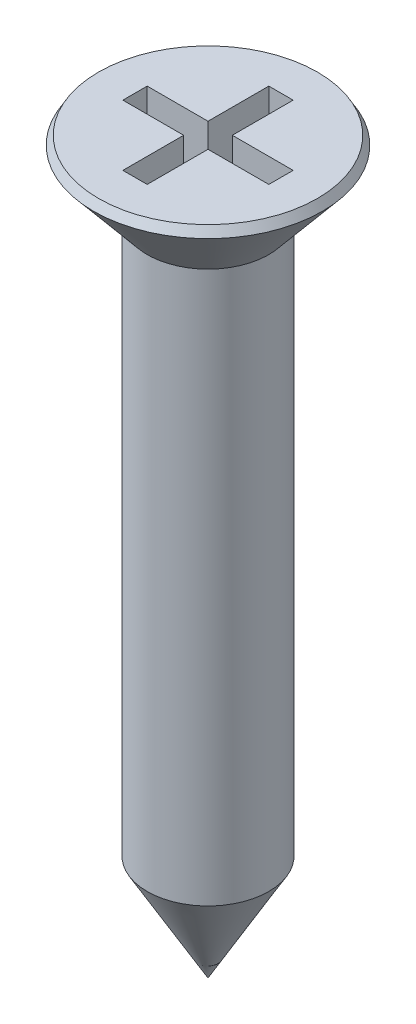
ISO-10303-21;
HEADER;
FILE_DESCRIPTION(('STEP AP214'),'2;1');
FILE_NAME('part.step','',(''),(''),'','','');
FILE_SCHEMA(('AUTOMOTIVE_DESIGN { 1 0 10303 214 1 1 1 1 }'));
ENDSEC;
DATA;
#1=APPLICATION_CONTEXT('core data for automotive mechanical design processes');
#2=APPLICATION_PROTOCOL_DEFINITION('international standard','automotive_design',2000,#1);
#3=PRODUCT_CONTEXT('',#1,'mechanical');
#4=PRODUCT('Part','Part','',(#3));
#5=PRODUCT_RELATED_PRODUCT_CATEGORY('part','',(#4));
#6=PRODUCT_DEFINITION_FORMATION('','',#4);
#7=PRODUCT_DEFINITION_CONTEXT('part definition',#1,'design');
#8=PRODUCT_DEFINITION('design','',#6,#7);
#9=PRODUCT_DEFINITION_SHAPE('','',#8);
#10=(LENGTH_UNIT() NAMED_UNIT(*) SI_UNIT(.MILLI.,.METRE.));
#11=(NAMED_UNIT(*) PLANE_ANGLE_UNIT() SI_UNIT($,.RADIAN.));
#12=(NAMED_UNIT(*) SI_UNIT($,.STERADIAN.) SOLID_ANGLE_UNIT());
#13=UNCERTAINTY_MEASURE_WITH_UNIT(LENGTH_MEASURE(1.E-05),#10,'distance_accuracy_value','');
#14=(GEOMETRIC_REPRESENTATION_CONTEXT(3) GLOBAL_UNCERTAINTY_ASSIGNED_CONTEXT((#13)) GLOBAL_UNIT_ASSIGNED_CONTEXT((#10,
#11,#12)) REPRESENTATION_CONTEXT('',''));
#15=CARTESIAN_POINT('',(0.,0.,0.));
#16=DIRECTION('',(0.,0.,1.));
#17=DIRECTION('',(1.,0.,0.));
#18=AXIS2_PLACEMENT_3D('',#15,#16,#17);
#19=CARTESIAN_POINT('',(1.,6.,0.));
#20=DIRECTION('',(0.,1.,0.));
#21=DIRECTION('',(0.,0.,1.));
#22=AXIS2_PLACEMENT_3D('',#19,#20,#21);
#23=PLANE('',#22);
#24=DIRECTION('',(-1.,0.,9.83856550944247E-12));
#25=VECTOR('',#24,1.);
#26=CARTESIAN_POINT('',(0.100000000014081,6.,-0.0999999999950807));
#27=LINE('',#26,#25);
#28=CARTESIAN_POINT('',(0.6,6.,-0.1));
#29=VERTEX_POINT('',#28);
#30=CARTESIAN_POINT('',(0.100000000014081,6.,-0.0999999999950807));
#31=VERTEX_POINT('',#30);
#32=EDGE_CURVE('E53',#29,#31,#27,.T.);
#33=ORIENTED_EDGE('',*,*,#32,.F.);
#34=DIRECTION('',(0.,0.,-1.));
#35=VECTOR('',#34,1.);
#36=CARTESIAN_POINT('',(0.6,6.,0.1));
#37=LINE('',#36,#35);
#38=CARTESIAN_POINT('',(0.6,6.,0.1));
#39=VERTEX_POINT('',#38);
#40=EDGE_CURVE('E148',#39,#29,#37,.T.);
#41=ORIENTED_EDGE('',*,*,#40,.F.);
#42=DIRECTION('',(1.,0.,0.));
#43=VECTOR('',#42,1.);
#44=CARTESIAN_POINT('',(0.1,6.,0.1));
#45=LINE('',#44,#43);
#46=CARTESIAN_POINT('',(0.1,6.,0.1));
#47=VERTEX_POINT('',#46);
#48=EDGE_CURVE('E151',#47,#39,#45,.T.);
#49=ORIENTED_EDGE('',*,*,#48,.F.);
#50=DIRECTION('',(-2.84052295562959E-11,0.,-1.));
#51=VECTOR('',#50,1.);
#52=CARTESIAN_POINT('',(0.100000000014203,6.,0.600000000019122));
#53=LINE('',#52,#51);
#54=CARTESIAN_POINT('',(0.100000000014203,6.,0.600000000019122));
#55=VERTEX_POINT('',#54);
#56=EDGE_CURVE('E203',#55,#47,#53,.T.);
#57=ORIENTED_EDGE('',*,*,#56,.F.);
#58=DIRECTION('',(1.,0.,-1.21430643318391E-13));
#59=VECTOR('',#58,1.);
#60=CARTESIAN_POINT('',(-0.0999999999857728,6.,0.600000000019146));
#61=LINE('',#60,#59);
#62=CARTESIAN_POINT('',(-0.0999999999857728,6.,0.600000000019146));
#63=VERTEX_POINT('',#62);
#64=EDGE_CURVE('E200',#63,#55,#61,.T.);
#65=ORIENTED_EDGE('',*,*,#64,.F.);
#66=DIRECTION('',(-2.17497461012202E-11,0.,1.));
#67=VECTOR('',#66,1.);
#68=CARTESIAN_POINT('',(-0.0999999999857728,6.,0.600000000019146));
#69=LINE('',#68,#67);
#70=CARTESIAN_POINT('',(-0.0999999999748979,6.,0.100000000015871));
#71=VERTEX_POINT('',#70);
#72=EDGE_CURVE('E197',#71,#63,#69,.T.);
#73=ORIENTED_EDGE('',*,*,#72,.F.);
#74=DIRECTION('',(1.,0.,3.17413467455809E-11));
#75=VECTOR('',#74,1.);
#76=CARTESIAN_POINT('',(-0.6,6.,0.1));
#77=LINE('',#76,#75);
#78=CARTESIAN_POINT('',(-0.6,6.,0.1));
#79=VERTEX_POINT('',#78);
#80=EDGE_CURVE('E194',#79,#71,#77,.T.);
#81=ORIENTED_EDGE('',*,*,#80,.F.);
#82=DIRECTION('',(0.,0.,1.));
#83=VECTOR('',#82,1.);
#84=CARTESIAN_POINT('',(-0.6,6.,0.1));
#85=LINE('',#84,#83);
#86=CARTESIAN_POINT('',(-0.6,6.,-0.1));
#87=VERTEX_POINT('',#86);
#88=EDGE_CURVE('E191',#87,#79,#85,.T.);
#89=ORIENTED_EDGE('',*,*,#88,.F.);
#90=DIRECTION('',(-1.,0.,0.));
#91=VECTOR('',#90,1.);
#92=CARTESIAN_POINT('',(-0.6,6.,-0.1));
#93=LINE('',#92,#91);
#94=CARTESIAN_POINT('',(-0.1,6.,-0.1));
#95=VERTEX_POINT('',#94);
#96=EDGE_CURVE('E188',#95,#87,#93,.T.);
#97=ORIENTED_EDGE('',*,*,#96,.F.);
#98=DIRECTION('',(-2.82752879280875E-11,0.,1.));
#99=VECTOR('',#98,1.);
#100=CARTESIAN_POINT('',(-0.1,6.,-0.1));
#101=LINE('',#100,#99);
#102=CARTESIAN_POINT('',(-0.0999999999858627,6.,-0.599999999980943));
#103=VERTEX_POINT('',#102);
#104=EDGE_CURVE('E185',#103,#95,#101,.T.);
#105=ORIENTED_EDGE('',*,*,#104,.F.);
#106=DIRECTION('',(-1.,0.,1.21430643318391E-13));
#107=VECTOR('',#106,1.);
#108=CARTESIAN_POINT('',(-0.0999999999858627,6.,-0.599999999980943));
#109=LINE('',#108,#107);
#110=CARTESIAN_POINT('',(0.100000000014113,6.,-0.599999999980968));
#111=VERTEX_POINT('',#110);
#112=EDGE_CURVE('E182',#111,#103,#109,.T.);
#113=ORIENTED_EDGE('',*,*,#112,.F.);
#114=DIRECTION('',(0.,0.,-1.));
#115=VECTOR('',#114,1.);
#116=CARTESIAN_POINT('',(0.100000000014081,6.,-0.0999999999950807));
#117=LINE('',#116,#115);
#118=EDGE_CURVE('E180',#31,#111,#117,.T.);
#119=ORIENTED_EDGE('',*,*,#118,.F.);
#120=EDGE_LOOP('',(#33,#41,#49,#57,#65,#73,#81,#89,#97,#105,#113,#119));
#121=FACE_BOUND('',#120,.T.);
#122=CARTESIAN_POINT('',(0.,6.,0.));
#123=DIRECTION('',(0.,1.,0.));
#124=DIRECTION('',(0.,0.,1.));
#125=AXIS2_PLACEMENT_3D('',#122,#123,#124);
#126=CIRCLE('',#125,0.900000000000001);
#127=CARTESIAN_POINT('',(0.,6.,0.900000000000001));
#128=VERTEX_POINT('',#127);
#129=EDGE_CURVE('E11',#128,#128,#126,.T.);
#130=ORIENTED_EDGE('',*,*,#129,.T.);
#131=EDGE_LOOP('',(#130));
#132=FACE_BOUND('',#131,.T.);
#133=ADVANCED_FACE('F37',(#121,#132),#23,.T.);
#134=CARTESIAN_POINT('',(0.,0.,0.));
#135=DIRECTION('',(0.,1.,0.));
#136=DIRECTION('',(0.,0.,1.));
#137=AXIS2_PLACEMENT_3D('',#134,#135,#136);
#138=CONICAL_SURFACE('',#137,0.,0.5235987755983);
#139=CARTESIAN_POINT('',(0.,0.866025403784436,0.));
#140=DIRECTION('',(0.,-1.,0.));
#141=DIRECTION('',(0.,0.,-1.));
#142=AXIS2_PLACEMENT_3D('',#139,#140,#141);
#143=CIRCLE('',#142,0.5);
#144=CARTESIAN_POINT('',(0.,0.866025403784436,-0.5));
#145=VERTEX_POINT('',#144);
#146=EDGE_CURVE('E232',#145,#145,#143,.T.);
#147=ORIENTED_EDGE('',*,*,#146,.T.);
#148=EDGE_LOOP('',(#147));
#149=FACE_BOUND('',#148,.T.);
#150=CARTESIAN_POINT('',(0.,0.,0.));
#151=VERTEX_POINT('',#150);
#152=VERTEX_LOOP('',#151);
#153=FACE_BOUND('',#152,.T.);
#154=ADVANCED_FACE('F252',(#149,#153),#138,.T.);
#155=CARTESIAN_POINT('',(0.,-3.24904047717973E-12,0.));
#156=DIRECTION('',(0.,-1.,0.));
#157=DIRECTION('',(0.,0.,-1.));
#158=AXIS2_PLACEMENT_3D('',#155,#156,#157);
#159=CYLINDRICAL_SURFACE('',#158,0.5);
#160=CARTESIAN_POINT('',(0.,5.4,0.));
#161=DIRECTION('',(0.,-1.,0.));
#162=DIRECTION('',(0.,0.,-1.));
#163=AXIS2_PLACEMENT_3D('',#160,#161,#162);
#164=CIRCLE('',#163,0.5);
#165=CARTESIAN_POINT('',(0.,5.4,-0.5));
#166=VERTEX_POINT('',#165);
#167=EDGE_CURVE('E210',#166,#166,#164,.T.);
#168=ORIENTED_EDGE('',*,*,#167,.T.);
#169=EDGE_LOOP('',(#168));
#170=FACE_BOUND('',#169,.T.);
#171=ORIENTED_EDGE('',*,*,#146,.F.);
#172=EDGE_LOOP('',(#171));
#173=FACE_BOUND('',#172,.T.);
#174=ADVANCED_FACE('F248',(#170,#173),#159,.T.);
#175=CARTESIAN_POINT('',(0.,5.4,0.));
#176=DIRECTION('',(0.,1.,0.));
#177=DIRECTION('',(0.,0.,1.));
#178=AXIS2_PLACEMENT_3D('',#175,#176,#177);
#179=CONICAL_SURFACE('',#178,0.5,0.694738276196703);
#180=CARTESIAN_POINT('',(0.,5.92911238223713,0.));
#181=DIRECTION('',(0.,-1.,0.));
#182=DIRECTION('',(0.,0.,-1.));
#183=AXIS2_PLACEMENT_3D('',#180,#181,#182);
#184=CIRCLE('',#183,0.940926985197607);
#185=CARTESIAN_POINT('',(0.,5.92911238223713,-0.940926985197607));
#186=VERTEX_POINT('',#185);
#187=EDGE_CURVE('E46',#186,#186,#184,.T.);
#188=ORIENTED_EDGE('',*,*,#187,.T.);
#189=EDGE_LOOP('',(#188));
#190=FACE_BOUND('',#189,.T.);
#191=ORIENTED_EDGE('',*,*,#167,.F.);
#192=EDGE_LOOP('',(#191));
#193=FACE_BOUND('',#192,.T.);
#194=ADVANCED_FACE('F237',(#190,#193),#179,.T.);
#195=CARTESIAN_POINT('',(0.,5.92911238223713,0.));
#196=DIRECTION('',(0.,-1.,0.));
#197=DIRECTION('',(0.,0.,-1.));
#198=AXIS2_PLACEMENT_3D('',#195,#196,#197);
#199=CONICAL_SURFACE('',#198,0.940926985197606,0.523598775598298);
#200=ORIENTED_EDGE('',*,*,#129,.F.);
#201=EDGE_LOOP('',(#200));
#202=FACE_BOUND('',#201,.T.);
#203=ORIENTED_EDGE('',*,*,#187,.F.);
#204=EDGE_LOOP('',(#203));
#205=FACE_BOUND('',#204,.T.);
#206=ADVANCED_FACE('F40',(#202,#205),#199,.T.);
#207=CARTESIAN_POINT('',(0.100000000014081,5.6,-0.0999999999950807));
#208=DIRECTION('',(-9.83856550944247E-12,0.,-1.));
#209=DIRECTION('',(-1.,0.,9.83856550944247E-12));
#210=AXIS2_PLACEMENT_3D('',#207,#208,#209);
#211=PLANE('',#210);
#212=ORIENTED_EDGE('',*,*,#32,.T.);
#213=DIRECTION('',(0.,1.,0.));
#214=VECTOR('',#213,1.);
#215=CARTESIAN_POINT('',(0.100000000014081,5.6,-0.0999999999950807));
#216=LINE('',#215,#214);
#217=CARTESIAN_POINT('',(0.100000000014081,5.6,-0.0999999999950807));
#218=VERTEX_POINT('',#217);
#219=EDGE_CURVE('E125',#218,#31,#216,.T.);
#220=ORIENTED_EDGE('',*,*,#219,.F.);
#221=DIRECTION('',(-1.,0.,9.83856550944247E-12));
#222=VECTOR('',#221,1.);
#223=CARTESIAN_POINT('',(0.100000000014081,5.6,-0.0999999999950807));
#224=LINE('',#223,#222);
#225=CARTESIAN_POINT('',(0.6,5.6,-0.1));
#226=VERTEX_POINT('',#225);
#227=EDGE_CURVE('E129',#226,#218,#224,.T.);
#228=ORIENTED_EDGE('',*,*,#227,.F.);
#229=DIRECTION('',(0.,1.,0.));
#230=VECTOR('',#229,1.);
#231=CARTESIAN_POINT('',(0.6,5.6,-0.1));
#232=LINE('',#231,#230);
#233=EDGE_CURVE('E208',#226,#29,#232,.T.);
#234=ORIENTED_EDGE('',*,*,#233,.T.);
#235=EDGE_LOOP('',(#212,#220,#228,#234));
#236=FACE_BOUND('',#235,.T.);
#237=ADVANCED_FACE('F127',(#236),#211,.F.);
#238=CARTESIAN_POINT('',(0.6,5.6,0.1));
#239=DIRECTION('',(1.,0.,0.));
#240=DIRECTION('',(0.,0.,-1.));
#241=AXIS2_PLACEMENT_3D('',#238,#239,#240);
#242=PLANE('',#241);
#243=ORIENTED_EDGE('',*,*,#40,.T.);
#244=ORIENTED_EDGE('',*,*,#233,.F.);
#245=DIRECTION('',(0.,0.,-1.));
#246=VECTOR('',#245,1.);
#247=CARTESIAN_POINT('',(0.6,5.6,0.1));
#248=LINE('',#247,#246);
#249=CARTESIAN_POINT('',(0.6,5.6,0.1));
#250=VERTEX_POINT('',#249);
#251=EDGE_CURVE('E135',#250,#226,#248,.T.);
#252=ORIENTED_EDGE('',*,*,#251,.F.);
#253=DIRECTION('',(0.,1.,0.));
#254=VECTOR('',#253,1.);
#255=CARTESIAN_POINT('',(0.6,5.6,0.1));
#256=LINE('',#255,#254);
#257=EDGE_CURVE('E211',#250,#39,#256,.T.);
#258=ORIENTED_EDGE('',*,*,#257,.T.);
#259=EDGE_LOOP('',(#243,#244,#252,#258));
#260=FACE_BOUND('',#259,.T.);
#261=ADVANCED_FACE('F246',(#260),#242,.F.);
#262=CARTESIAN_POINT('',(0.1,5.6,0.1));
#263=DIRECTION('',(0.,0.,1.));
#264=DIRECTION('',(1.,0.,0.));
#265=AXIS2_PLACEMENT_3D('',#262,#263,#264);
#266=PLANE('',#265);
#267=ORIENTED_EDGE('',*,*,#48,.T.);
#268=ORIENTED_EDGE('',*,*,#257,.F.);
#269=DIRECTION('',(1.,0.,0.));
#270=VECTOR('',#269,1.);
#271=CARTESIAN_POINT('',(0.1,5.6,0.1));
#272=LINE('',#271,#270);
#273=CARTESIAN_POINT('',(0.1,5.6,0.1));
#274=VERTEX_POINT('',#273);
#275=EDGE_CURVE('E176',#274,#250,#272,.T.);
#276=ORIENTED_EDGE('',*,*,#275,.F.);
#277=DIRECTION('',(0.,1.,0.));
#278=VECTOR('',#277,1.);
#279=CARTESIAN_POINT('',(0.1,5.6,0.1));
#280=LINE('',#279,#278);
#281=EDGE_CURVE('E213',#274,#47,#280,.T.);
#282=ORIENTED_EDGE('',*,*,#281,.T.);
#283=EDGE_LOOP('',(#267,#268,#276,#282));
#284=FACE_BOUND('',#283,.T.);
#285=ADVANCED_FACE('F297',(#284),#266,.F.);
#286=CARTESIAN_POINT('',(0.100000000014203,5.6,0.600000000019122));
#287=DIRECTION('',(1.,0.,-2.84052295562959E-11));
#288=DIRECTION('',(-2.84052295562959E-11,0.,-1.));
#289=AXIS2_PLACEMENT_3D('',#286,#287,#288);
#290=PLANE('',#289);
#291=ORIENTED_EDGE('',*,*,#56,.T.);
#292=ORIENTED_EDGE('',*,*,#281,.F.);
#293=DIRECTION('',(-2.84052295562959E-11,0.,-1.));
#294=VECTOR('',#293,1.);
#295=CARTESIAN_POINT('',(0.100000000014203,5.6,0.600000000019122));
#296=LINE('',#295,#294);
#297=CARTESIAN_POINT('',(0.100000000014203,5.6,0.600000000019122));
#298=VERTEX_POINT('',#297);
#299=EDGE_CURVE('E173',#298,#274,#296,.T.);
#300=ORIENTED_EDGE('',*,*,#299,.F.);
#301=DIRECTION('',(0.,1.,0.));
#302=VECTOR('',#301,1.);
#303=CARTESIAN_POINT('',(0.100000000014203,5.6,0.600000000019122));
#304=LINE('',#303,#302);
#305=EDGE_CURVE('E215',#298,#55,#304,.T.);
#306=ORIENTED_EDGE('',*,*,#305,.T.);
#307=EDGE_LOOP('',(#291,#292,#300,#306));
#308=FACE_BOUND('',#307,.T.);
#309=ADVANCED_FACE('F293',(#308),#290,.F.);
#310=CARTESIAN_POINT('',(-0.0999999999857728,5.6,0.600000000019146));
#311=DIRECTION('',(1.21430643318391E-13,0.,1.));
#312=DIRECTION('',(1.,0.,-1.21430643318391E-13));
#313=AXIS2_PLACEMENT_3D('',#310,#311,#312);
#314=PLANE('',#313);
#315=ORIENTED_EDGE('',*,*,#64,.T.);
#316=ORIENTED_EDGE('',*,*,#305,.F.);
#317=DIRECTION('',(1.,0.,-1.21430643318391E-13));
#318=VECTOR('',#317,1.);
#319=CARTESIAN_POINT('',(-0.0999999999857728,5.6,0.600000000019146));
#320=LINE('',#319,#318);
#321=CARTESIAN_POINT('',(-0.0999999999857728,5.6,0.600000000019146));
#322=VERTEX_POINT('',#321);
#323=EDGE_CURVE('E170',#322,#298,#320,.T.);
#324=ORIENTED_EDGE('',*,*,#323,.F.);
#325=DIRECTION('',(0.,1.,0.));
#326=VECTOR('',#325,1.);
#327=CARTESIAN_POINT('',(-0.0999999999857728,5.6,0.600000000019146));
#328=LINE('',#327,#326);
#329=EDGE_CURVE('E217',#322,#63,#328,.T.);
#330=ORIENTED_EDGE('',*,*,#329,.T.);
#331=EDGE_LOOP('',(#315,#316,#324,#330));
#332=FACE_BOUND('',#331,.T.);
#333=ADVANCED_FACE('F289',(#332),#314,.F.);
#334=CARTESIAN_POINT('',(-0.0999999999857728,5.6,0.600000000019146));
#335=DIRECTION('',(-1.,0.,-2.17497461012202E-11));
#336=DIRECTION('',(-2.17497461012202E-11,0.,1.));
#337=AXIS2_PLACEMENT_3D('',#334,#335,#336);
#338=PLANE('',#337);
#339=ORIENTED_EDGE('',*,*,#72,.T.);
#340=ORIENTED_EDGE('',*,*,#329,.F.);
#341=DIRECTION('',(-2.17497461012202E-11,0.,1.));
#342=VECTOR('',#341,1.);
#343=CARTESIAN_POINT('',(-0.0999999999857728,5.6,0.600000000019146));
#344=LINE('',#343,#342);
#345=CARTESIAN_POINT('',(-0.0999999999748979,5.6,0.100000000015871));
#346=VERTEX_POINT('',#345);
#347=EDGE_CURVE('E167',#346,#322,#344,.T.);
#348=ORIENTED_EDGE('',*,*,#347,.F.);
#349=DIRECTION('',(0.,1.,0.));
#350=VECTOR('',#349,1.);
#351=CARTESIAN_POINT('',(-0.0999999999748979,5.6,0.100000000015871));
#352=LINE('',#351,#350);
#353=EDGE_CURVE('E219',#346,#71,#352,.T.);
#354=ORIENTED_EDGE('',*,*,#353,.T.);
#355=EDGE_LOOP('',(#339,#340,#348,#354));
#356=FACE_BOUND('',#355,.T.);
#357=ADVANCED_FACE('F285',(#356),#338,.F.);
#358=CARTESIAN_POINT('',(-0.6,5.6,0.1));
#359=DIRECTION('',(-3.17413467455809E-11,0.,1.));
#360=DIRECTION('',(1.,0.,3.17413467455809E-11));
#361=AXIS2_PLACEMENT_3D('',#358,#359,#360);
#362=PLANE('',#361);
#363=ORIENTED_EDGE('',*,*,#80,.T.);
#364=ORIENTED_EDGE('',*,*,#353,.F.);
#365=DIRECTION('',(1.,0.,3.17413467455809E-11));
#366=VECTOR('',#365,1.);
#367=CARTESIAN_POINT('',(-0.6,5.6,0.1));
#368=LINE('',#367,#366);
#369=CARTESIAN_POINT('',(-0.6,5.6,0.1));
#370=VERTEX_POINT('',#369);
#371=EDGE_CURVE('E164',#370,#346,#368,.T.);
#372=ORIENTED_EDGE('',*,*,#371,.F.);
#373=DIRECTION('',(0.,1.,0.));
#374=VECTOR('',#373,1.);
#375=CARTESIAN_POINT('',(-0.6,5.6,0.1));
#376=LINE('',#375,#374);
#377=EDGE_CURVE('E221',#370,#79,#376,.T.);
#378=ORIENTED_EDGE('',*,*,#377,.T.);
#379=EDGE_LOOP('',(#363,#364,#372,#378));
#380=FACE_BOUND('',#379,.T.);
#381=ADVANCED_FACE('F281',(#380),#362,.F.);
#382=CARTESIAN_POINT('',(-0.6,5.6,0.1));
#383=DIRECTION('',(-1.,0.,0.));
#384=DIRECTION('',(0.,0.,1.));
#385=AXIS2_PLACEMENT_3D('',#382,#383,#384);
#386=PLANE('',#385);
#387=ORIENTED_EDGE('',*,*,#88,.T.);
#388=ORIENTED_EDGE('',*,*,#377,.F.);
#389=DIRECTION('',(0.,0.,1.));
#390=VECTOR('',#389,1.);
#391=CARTESIAN_POINT('',(-0.6,5.6,0.1));
#392=LINE('',#391,#390);
#393=CARTESIAN_POINT('',(-0.6,5.6,-0.1));
#394=VERTEX_POINT('',#393);
#395=EDGE_CURVE('E161',#394,#370,#392,.T.);
#396=ORIENTED_EDGE('',*,*,#395,.F.);
#397=DIRECTION('',(0.,1.,0.));
#398=VECTOR('',#397,1.);
#399=CARTESIAN_POINT('',(-0.6,5.6,-0.1));
#400=LINE('',#399,#398);
#401=EDGE_CURVE('E223',#394,#87,#400,.T.);
#402=ORIENTED_EDGE('',*,*,#401,.T.);
#403=EDGE_LOOP('',(#387,#388,#396,#402));
#404=FACE_BOUND('',#403,.T.);
#405=ADVANCED_FACE('F277',(#404),#386,.F.);
#406=CARTESIAN_POINT('',(-0.6,5.6,-0.1));
#407=DIRECTION('',(0.,0.,-1.));
#408=DIRECTION('',(-1.,0.,0.));
#409=AXIS2_PLACEMENT_3D('',#406,#407,#408);
#410=PLANE('',#409);
#411=ORIENTED_EDGE('',*,*,#96,.T.);
#412=ORIENTED_EDGE('',*,*,#401,.F.);
#413=DIRECTION('',(-1.,0.,0.));
#414=VECTOR('',#413,1.);
#415=CARTESIAN_POINT('',(-0.6,5.6,-0.1));
#416=LINE('',#415,#414);
#417=CARTESIAN_POINT('',(-0.1,5.6,-0.1));
#418=VERTEX_POINT('',#417);
#419=EDGE_CURVE('E158',#418,#394,#416,.T.);
#420=ORIENTED_EDGE('',*,*,#419,.F.);
#421=DIRECTION('',(0.,1.,0.));
#422=VECTOR('',#421,1.);
#423=CARTESIAN_POINT('',(-0.1,5.6,-0.1));
#424=LINE('',#423,#422);
#425=EDGE_CURVE('E225',#418,#95,#424,.T.);
#426=ORIENTED_EDGE('',*,*,#425,.T.);
#427=EDGE_LOOP('',(#411,#412,#420,#426));
#428=FACE_BOUND('',#427,.T.);
#429=ADVANCED_FACE('F273',(#428),#410,.F.);
#430=CARTESIAN_POINT('',(-0.1,5.6,-0.1));
#431=DIRECTION('',(-1.,0.,-2.82752879280875E-11));
#432=DIRECTION('',(-2.82752879280875E-11,0.,1.));
#433=AXIS2_PLACEMENT_3D('',#430,#431,#432);
#434=PLANE('',#433);
#435=ORIENTED_EDGE('',*,*,#104,.T.);
#436=ORIENTED_EDGE('',*,*,#425,.F.);
#437=DIRECTION('',(-2.82752879280875E-11,0.,1.));
#438=VECTOR('',#437,1.);
#439=CARTESIAN_POINT('',(-0.1,5.6,-0.1));
#440=LINE('',#439,#438);
#441=CARTESIAN_POINT('',(-0.0999999999858627,5.6,-0.599999999980943));
#442=VERTEX_POINT('',#441);
#443=EDGE_CURVE('E155',#442,#418,#440,.T.);
#444=ORIENTED_EDGE('',*,*,#443,.F.);
#445=DIRECTION('',(0.,1.,0.));
#446=VECTOR('',#445,1.);
#447=CARTESIAN_POINT('',(-0.0999999999858627,5.6,-0.599999999980943));
#448=LINE('',#447,#446);
#449=EDGE_CURVE('E227',#442,#103,#448,.T.);
#450=ORIENTED_EDGE('',*,*,#449,.T.);
#451=EDGE_LOOP('',(#435,#436,#444,#450));
#452=FACE_BOUND('',#451,.T.);
#453=ADVANCED_FACE('F269',(#452),#434,.F.);
#454=CARTESIAN_POINT('',(-0.0999999999858627,5.6,-0.599999999980943));
#455=DIRECTION('',(-1.21430643318391E-13,0.,-1.));
#456=DIRECTION('',(-1.,0.,1.21430643318391E-13));
#457=AXIS2_PLACEMENT_3D('',#454,#455,#456);
#458=PLANE('',#457);
#459=ORIENTED_EDGE('',*,*,#112,.T.);
#460=ORIENTED_EDGE('',*,*,#449,.F.);
#461=DIRECTION('',(-1.,0.,1.21430643318391E-13));
#462=VECTOR('',#461,1.);
#463=CARTESIAN_POINT('',(-0.0999999999858627,5.6,-0.599999999980943));
#464=LINE('',#463,#462);
#465=CARTESIAN_POINT('',(0.100000000014113,5.6,-0.599999999980968));
#466=VERTEX_POINT('',#465);
#467=EDGE_CURVE('E143',#466,#442,#464,.T.);
#468=ORIENTED_EDGE('',*,*,#467,.F.);
#469=DIRECTION('',(0.,1.,0.));
#470=VECTOR('',#469,1.);
#471=CARTESIAN_POINT('',(0.100000000014113,5.6,-0.599999999980968));
#472=LINE('',#471,#470);
#473=EDGE_CURVE('E134',#466,#111,#472,.T.);
#474=ORIENTED_EDGE('',*,*,#473,.T.);
#475=EDGE_LOOP('',(#459,#460,#468,#474));
#476=FACE_BOUND('',#475,.T.);
#477=ADVANCED_FACE('F266',(#476),#458,.F.);
#478=CARTESIAN_POINT('',(0.100000000014081,5.6,-0.0999999999950807));
#479=DIRECTION('',(1.,0.,0.));
#480=DIRECTION('',(0.,0.,-1.));
#481=AXIS2_PLACEMENT_3D('',#478,#479,#480);
#482=PLANE('',#481);
#483=ORIENTED_EDGE('',*,*,#118,.T.);
#484=ORIENTED_EDGE('',*,*,#473,.F.);
#485=DIRECTION('',(0.,0.,-1.));
#486=VECTOR('',#485,1.);
#487=CARTESIAN_POINT('',(0.100000000014081,5.6,-0.0999999999950807));
#488=LINE('',#487,#486);
#489=EDGE_CURVE('E138',#218,#466,#488,.T.);
#490=ORIENTED_EDGE('',*,*,#489,.F.);
#491=ORIENTED_EDGE('',*,*,#219,.T.);
#492=EDGE_LOOP('',(#483,#484,#490,#491));
#493=FACE_BOUND('',#492,.T.);
#494=ADVANCED_FACE('F139',(#493),#482,.F.);
#495=CARTESIAN_POINT('',(0.,5.6,0.));
#496=DIRECTION('',(0.,1.,0.));
#497=DIRECTION('',(0.,0.,1.));
#498=AXIS2_PLACEMENT_3D('',#495,#496,#497);
#499=PLANE('',#498);
#500=ORIENTED_EDGE('',*,*,#227,.T.);
#501=ORIENTED_EDGE('',*,*,#489,.T.);
#502=ORIENTED_EDGE('',*,*,#467,.T.);
#503=ORIENTED_EDGE('',*,*,#443,.T.);
#504=ORIENTED_EDGE('',*,*,#419,.T.);
#505=ORIENTED_EDGE('',*,*,#395,.T.);
#506=ORIENTED_EDGE('',*,*,#371,.T.);
#507=ORIENTED_EDGE('',*,*,#347,.T.);
#508=ORIENTED_EDGE('',*,*,#323,.T.);
#509=ORIENTED_EDGE('',*,*,#299,.T.);
#510=ORIENTED_EDGE('',*,*,#275,.T.);
#511=ORIENTED_EDGE('',*,*,#251,.T.);
#512=EDGE_LOOP('',(#500,#501,#502,#503,#504,#505,#506,#507,#508,#509,#510,#511));
#513=FACE_BOUND('',#512,.T.);
#514=ADVANCED_FACE('F145',(#513),#499,.T.);
#515=CLOSED_SHELL('',(#133,#154,#174,#194,#206,#237,#261,#285,#309,#333,#357,#381,#405,#429,
#453,#477,#494,#514));
#516=MANIFOLD_SOLID_BREP('B2',#515);
#517=ADVANCED_BREP_SHAPE_REPRESENTATION('',(#18,#516),#14);
#518=SHAPE_DEFINITION_REPRESENTATION(#9,#517);
ENDSEC;
END-ISO-10303-21;
